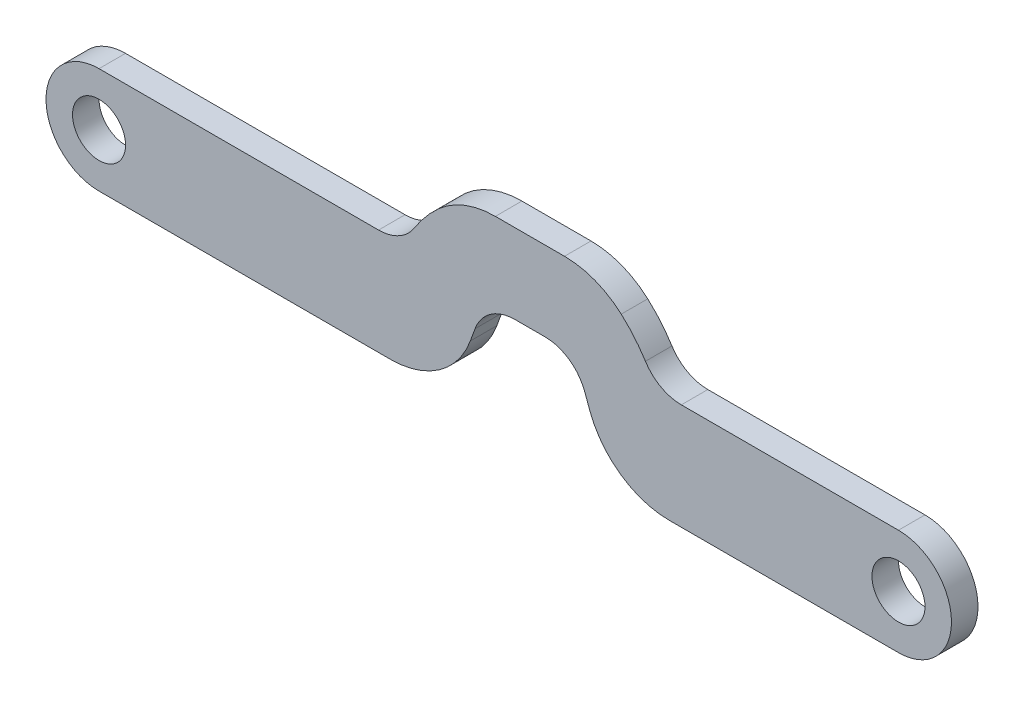
ISO-10303-21;
HEADER;
FILE_DESCRIPTION(('STEP AP214'),'2;1');
FILE_NAME('part.step','',(''),(''),'','','');
FILE_SCHEMA(('AUTOMOTIVE_DESIGN { 1 0 10303 214 1 1 1 1 }'));
ENDSEC;
DATA;
#1=APPLICATION_CONTEXT('core data for automotive mechanical design processes');
#2=APPLICATION_PROTOCOL_DEFINITION('international standard','automotive_design',2000,#1);
#3=PRODUCT_CONTEXT('',#1,'mechanical');
#4=PRODUCT('Part','Part','',(#3));
#5=PRODUCT_RELATED_PRODUCT_CATEGORY('part','',(#4));
#6=PRODUCT_DEFINITION_FORMATION('','',#4);
#7=PRODUCT_DEFINITION_CONTEXT('part definition',#1,'design');
#8=PRODUCT_DEFINITION('design','',#6,#7);
#9=PRODUCT_DEFINITION_SHAPE('','',#8);
#10=(LENGTH_UNIT() NAMED_UNIT(*) SI_UNIT(.MILLI.,.METRE.));
#11=(NAMED_UNIT(*) PLANE_ANGLE_UNIT() SI_UNIT($,.RADIAN.));
#12=(NAMED_UNIT(*) SI_UNIT($,.STERADIAN.) SOLID_ANGLE_UNIT());
#13=UNCERTAINTY_MEASURE_WITH_UNIT(LENGTH_MEASURE(1.E-05),#10,'distance_accuracy_value','');
#14=(GEOMETRIC_REPRESENTATION_CONTEXT(3) GLOBAL_UNCERTAINTY_ASSIGNED_CONTEXT((#13)) GLOBAL_UNIT_ASSIGNED_CONTEXT((#10,
#11,#12)) REPRESENTATION_CONTEXT('',''));
#15=CARTESIAN_POINT('',(0.,0.,0.));
#16=DIRECTION('',(0.,0.,1.));
#17=DIRECTION('',(1.,0.,0.));
#18=AXIS2_PLACEMENT_3D('',#15,#16,#17);
#19=CARTESIAN_POINT('',(0.,-2.,0.5));
#20=DIRECTION('',(0.,1.,0.));
#21=DIRECTION('',(-1.,0.,0.));
#22=AXIS2_PLACEMENT_3D('',#19,#20,#21);
#23=PLANE('',#22);
#24=DIRECTION('',(1.,0.,0.));
#25=VECTOR('',#24,1.);
#26=CARTESIAN_POINT('',(0.,-2.,0.5));
#27=LINE('',#26,#25);
#28=CARTESIAN_POINT('',(-8.64341319837332,-2.,0.5));
#29=VERTEX_POINT('',#28);
#30=CARTESIAN_POINT('',(0.,-2.,0.5));
#31=VERTEX_POINT('',#30);
#32=EDGE_CURVE('E176',#29,#31,#27,.T.);
#33=ORIENTED_EDGE('',*,*,#32,.F.);
#34=DIRECTION('',(0.,0.,1.));
#35=VECTOR('',#34,1.);
#36=CARTESIAN_POINT('',(-8.64341319837332,-2.,-0.5));
#37=LINE('',#36,#35);
#38=CARTESIAN_POINT('',(-8.64341319837332,-2.,-0.5));
#39=VERTEX_POINT('',#38);
#40=EDGE_CURVE('E62',#29,#39,#37,.F.);
#41=ORIENTED_EDGE('',*,*,#40,.T.);
#42=DIRECTION('',(1.,0.,0.));
#43=VECTOR('',#42,1.);
#44=CARTESIAN_POINT('',(0.,-2.,-0.5));
#45=LINE('',#44,#43);
#46=CARTESIAN_POINT('',(0.,-2.,-0.5));
#47=VERTEX_POINT('',#46);
#48=EDGE_CURVE('E199',#39,#47,#45,.T.);
#49=ORIENTED_EDGE('',*,*,#48,.T.);
#50=DIRECTION('',(0.,0.,-1.));
#51=VECTOR('',#50,1.);
#52=CARTESIAN_POINT('',(0.,-2.,0.5));
#53=LINE('',#52,#51);
#54=EDGE_CURVE('E194',#31,#47,#53,.T.);
#55=ORIENTED_EDGE('',*,*,#54,.F.);
#56=EDGE_LOOP('',(#33,#41,#49,#55));
#57=FACE_BOUND('',#56,.T.);
#58=ADVANCED_FACE('F39',(#57),#23,.F.);
#59=CARTESIAN_POINT('',(0.,0.,0.5));
#60=DIRECTION('',(0.,0.,1.));
#61=DIRECTION('',(1.,0.,0.));
#62=AXIS2_PLACEMENT_3D('',#59,#60,#61);
#63=PLANE('',#62);
#64=CARTESIAN_POINT('',(-13.9,0.,0.5));
#65=DIRECTION('',(0.,0.,1.));
#66=DIRECTION('',(1.,0.,0.));
#67=AXIS2_PLACEMENT_3D('',#64,#65,#66);
#68=CIRCLE('',#67,5.15);
#69=CARTESIAN_POINT('',(-9.543588377779,2.74666666666667,0.5));
#70=VERTEX_POINT('',#69);
#71=CARTESIAN_POINT('',(-10.4565238577648,3.82948717948718,0.5));
#72=VERTEX_POINT('',#71);
#73=EDGE_CURVE('E353',#70,#72,#68,.T.);
#74=ORIENTED_EDGE('',*,*,#73,.T.);
#75=CARTESIAN_POINT('',(-12.5961595189595,1.45,0.5));
#76=DIRECTION('',(0.,0.,1.));
#77=DIRECTION('',(1.,0.,0.));
#78=AXIS2_PLACEMENT_3D('',#75,#76,#77);
#79=CIRCLE('',#78,3.2);
#80=CARTESIAN_POINT('',(-12.5961595189595,4.65,0.5));
#81=VERTEX_POINT('',#80);
#82=EDGE_CURVE('E252',#72,#81,#79,.T.);
#83=ORIENTED_EDGE('',*,*,#82,.T.);
#84=DIRECTION('',(-1.,0.,0.));
#85=VECTOR('',#84,1.);
#86=CARTESIAN_POINT('',(0.,4.65,0.5));
#87=LINE('',#86,#85);
#88=CARTESIAN_POINT('',(-15.2038404810405,4.65,0.5));
#89=VERTEX_POINT('',#88);
#90=EDGE_CURVE('E345',#81,#89,#87,.T.);
#91=ORIENTED_EDGE('',*,*,#90,.T.);
#92=CARTESIAN_POINT('',(-15.2038404810405,1.45,0.5));
#93=DIRECTION('',(0.,0.,1.));
#94=DIRECTION('',(1.,0.,0.));
#95=AXIS2_PLACEMENT_3D('',#92,#93,#94);
#96=CIRCLE('',#95,3.2);
#97=CARTESIAN_POINT('',(-17.3434761422352,3.82948717948718,0.5));
#98=VERTEX_POINT('',#97);
#99=EDGE_CURVE('E250',#89,#98,#96,.T.);
#100=ORIENTED_EDGE('',*,*,#99,.T.);
#101=CARTESIAN_POINT('',(-18.256411622221,2.74666666666667,0.5));
#102=VERTEX_POINT('',#101);
#103=EDGE_CURVE('E354',#98,#102,#68,.T.);
#104=ORIENTED_EDGE('',*,*,#103,.T.);
#105=CARTESIAN_POINT('',(-19.6098598932023,3.6,0.5));
#106=DIRECTION('',(0.,0.,1.));
#107=DIRECTION('',(1.,0.,0.));
#108=AXIS2_PLACEMENT_3D('',#105,#106,#107);
#109=CIRCLE('',#108,1.6);
#110=CARTESIAN_POINT('',(-19.6098598932023,2.,0.5));
#111=VERTEX_POINT('',#110);
#112=EDGE_CURVE('E242',#102,#111,#109,.F.);
#113=ORIENTED_EDGE('',*,*,#112,.T.);
#114=DIRECTION('',(1.,0.,0.));
#115=VECTOR('',#114,1.);
#116=CARTESIAN_POINT('',(0.,2.,0.5));
#117=LINE('',#116,#115);
#118=CARTESIAN_POINT('',(-30.1536,2.,0.5));
#119=VERTEX_POINT('',#118);
#120=EDGE_CURVE('E293',#119,#111,#117,.T.);
#121=ORIENTED_EDGE('',*,*,#120,.F.);
#122=CARTESIAN_POINT('',(-30.1536,0.,0.5));
#123=DIRECTION('',(0.,0.,1.));
#124=DIRECTION('',(1.,0.,0.));
#125=AXIS2_PLACEMENT_3D('',#122,#123,#124);
#126=CIRCLE('',#125,2.);
#127=CARTESIAN_POINT('',(-30.1536,-2.,0.5));
#128=VERTEX_POINT('',#127);
#129=EDGE_CURVE('E287',#119,#128,#126,.T.);
#130=ORIENTED_EDGE('',*,*,#129,.T.);
#131=CARTESIAN_POINT('',(-19.1565868016267,-2.,0.5));
#132=VERTEX_POINT('',#131);
#133=EDGE_CURVE('E187',#128,#132,#27,.T.);
#134=ORIENTED_EDGE('',*,*,#133,.T.);
#135=CARTESIAN_POINT('',(-19.1565868016267,1.2,0.5));
#136=DIRECTION('',(0.,0.,1.));
#137=DIRECTION('',(1.,0.,0.));
#138=AXIS2_PLACEMENT_3D('',#135,#136,#137);
#139=CIRCLE('',#138,3.2);
#140=CARTESIAN_POINT('',(-16.1495704151118,0.105535541357851,0.5));
#141=VERTEX_POINT('',#140);
#142=EDGE_CURVE('E247',#132,#141,#139,.T.);
#143=ORIENTED_EDGE('',*,*,#142,.T.);
#144=DIRECTION('',(-0.342020143325671,-0.939692620785908,0.));
#145=VECTOR('',#144,1.);
#146=CARTESIAN_POINT('',(-14.2943480143666,5.20271719547167,0.5));
#147=LINE('',#146,#145);
#148=CARTESIAN_POINT('',(-15.9706074564059,0.59723222932107,0.5));
#149=VERTEX_POINT('',#148);
#150=EDGE_CURVE('E428',#149,#141,#147,.T.);
#151=ORIENTED_EDGE('',*,*,#150,.F.);
#152=CARTESIAN_POINT('',(-14.4670992631484,0.0499999999999962,0.5));
#153=DIRECTION('',(0.,0.,1.));
#154=DIRECTION('',(1.,0.,0.));
#155=AXIS2_PLACEMENT_3D('',#152,#153,#154);
#156=CIRCLE('',#155,1.6);
#157=CARTESIAN_POINT('',(-14.4670992631484,1.65,0.5));
#158=VERTEX_POINT('',#157);
#159=EDGE_CURVE('E231',#149,#158,#156,.F.);
#160=ORIENTED_EDGE('',*,*,#159,.T.);
#161=DIRECTION('',(1.,0.,0.));
#162=VECTOR('',#161,1.);
#163=CARTESIAN_POINT('',(0.,1.65,0.5));
#164=LINE('',#163,#162);
#165=CARTESIAN_POINT('',(-13.3329007368516,1.65,0.5));
#166=VERTEX_POINT('',#165);
#167=EDGE_CURVE('E434',#158,#166,#164,.T.);
#168=ORIENTED_EDGE('',*,*,#167,.T.);
#169=CARTESIAN_POINT('',(-13.3329007368516,0.0499999999999964,0.5));
#170=DIRECTION('',(0.,0.,1.));
#171=DIRECTION('',(1.,0.,0.));
#172=AXIS2_PLACEMENT_3D('',#169,#170,#171);
#173=CIRCLE('',#172,1.6);
#174=CARTESIAN_POINT('',(-11.8293925435941,0.597232229321065,0.5));
#175=VERTEX_POINT('',#174);
#176=EDGE_CURVE('E227',#166,#175,#173,.F.);
#177=ORIENTED_EDGE('',*,*,#176,.T.);
#178=DIRECTION('',(0.342020143325668,-0.939692620785909,0.));
#179=VECTOR('',#178,1.);
#180=CARTESIAN_POINT('',(-10.2536697449872,-3.73203057917125,0.5));
#181=LINE('',#180,#179);
#182=CARTESIAN_POINT('',(-11.6504295848882,0.105535541357863,0.5));
#183=VERTEX_POINT('',#182);
#184=EDGE_CURVE('E350',#175,#183,#181,.T.);
#185=ORIENTED_EDGE('',*,*,#184,.T.);
#186=CARTESIAN_POINT('',(-8.64341319837332,1.2,0.5));
#187=DIRECTION('',(0.,0.,1.));
#188=DIRECTION('',(1.,0.,0.));
#189=AXIS2_PLACEMENT_3D('',#186,#187,#188);
#190=CIRCLE('',#189,3.2);
#191=EDGE_CURVE('E185',#183,#29,#190,.T.);
#192=ORIENTED_EDGE('',*,*,#191,.T.);
#193=ORIENTED_EDGE('',*,*,#32,.T.);
#194=CARTESIAN_POINT('',(0.,0.,0.5));
#195=DIRECTION('',(0.,0.,1.));
#196=DIRECTION('',(1.,0.,0.));
#197=AXIS2_PLACEMENT_3D('',#194,#195,#196);
#198=CIRCLE('',#197,2.);
#199=CARTESIAN_POINT('',(0.,2.,0.5));
#200=VERTEX_POINT('',#199);
#201=EDGE_CURVE('E182',#31,#200,#198,.T.);
#202=ORIENTED_EDGE('',*,*,#201,.T.);
#203=CARTESIAN_POINT('',(-8.19014010679772,2.,0.5));
#204=VERTEX_POINT('',#203);
#205=EDGE_CURVE('E197',#204,#200,#117,.T.);
#206=ORIENTED_EDGE('',*,*,#205,.F.);
#207=CARTESIAN_POINT('',(-8.19014010679772,3.6,0.5));
#208=DIRECTION('',(0.,0.,1.));
#209=DIRECTION('',(1.,0.,0.));
#210=AXIS2_PLACEMENT_3D('',#207,#208,#209);
#211=CIRCLE('',#210,1.6);
#212=EDGE_CURVE('E235',#204,#70,#211,.F.);
#213=ORIENTED_EDGE('',*,*,#212,.T.);
#214=EDGE_LOOP('',(#74,#83,#91,#100,#104,#113,#121,#130,#134,#143,#151,#160,#168,#177,#185,#192,
#193,#202,#206,#213));
#215=FACE_BOUND('',#214,.T.);
#216=CARTESIAN_POINT('',(0.,0.,0.5));
#217=DIRECTION('',(0.,0.,1.));
#218=DIRECTION('',(1.,0.,0.));
#219=AXIS2_PLACEMENT_3D('',#216,#217,#218);
#220=CIRCLE('',#219,1.);
#221=CARTESIAN_POINT('',(1.,0.,0.5));
#222=VERTEX_POINT('',#221);
#223=EDGE_CURVE('E300',#222,#222,#220,.T.);
#224=ORIENTED_EDGE('',*,*,#223,.F.);
#225=EDGE_LOOP('',(#224));
#226=FACE_BOUND('',#225,.T.);
#227=CARTESIAN_POINT('',(-30.1536,0.,0.5));
#228=DIRECTION('',(0.,0.,1.));
#229=DIRECTION('',(1.,0.,0.));
#230=AXIS2_PLACEMENT_3D('',#227,#228,#229);
#231=CIRCLE('',#230,1.);
#232=CARTESIAN_POINT('',(-29.1536,0.,0.5));
#233=VERTEX_POINT('',#232);
#234=EDGE_CURVE('E297',#233,#233,#231,.T.);
#235=ORIENTED_EDGE('',*,*,#234,.F.);
#236=EDGE_LOOP('',(#235));
#237=FACE_BOUND('',#236,.T.);
#238=ADVANCED_FACE('F179',(#215,#226,#237),#63,.T.);
#239=CARTESIAN_POINT('',(0.,0.,-0.5));
#240=DIRECTION('',(0.,0.,1.));
#241=DIRECTION('',(1.,0.,0.));
#242=AXIS2_PLACEMENT_3D('',#239,#240,#241);
#243=PLANE('',#242);
#244=CARTESIAN_POINT('',(-30.1536,0.,-0.5));
#245=DIRECTION('',(0.,0.,1.));
#246=DIRECTION('',(1.,0.,0.));
#247=AXIS2_PLACEMENT_3D('',#244,#245,#246);
#248=CIRCLE('',#247,1.);
#249=CARTESIAN_POINT('',(-29.1536,0.,-0.5));
#250=VERTEX_POINT('',#249);
#251=EDGE_CURVE('E313',#250,#250,#248,.T.);
#252=ORIENTED_EDGE('',*,*,#251,.T.);
#253=EDGE_LOOP('',(#252));
#254=FACE_BOUND('',#253,.T.);
#255=CARTESIAN_POINT('',(0.,0.,-0.5));
#256=DIRECTION('',(0.,0.,1.));
#257=DIRECTION('',(1.,0.,0.));
#258=AXIS2_PLACEMENT_3D('',#255,#256,#257);
#259=CIRCLE('',#258,1.);
#260=CARTESIAN_POINT('',(1.,0.,-0.5));
#261=VERTEX_POINT('',#260);
#262=EDGE_CURVE('E188',#261,#261,#259,.T.);
#263=ORIENTED_EDGE('',*,*,#262,.T.);
#264=EDGE_LOOP('',(#263));
#265=FACE_BOUND('',#264,.T.);
#266=DIRECTION('',(-1.,0.,0.));
#267=VECTOR('',#266,1.);
#268=CARTESIAN_POINT('',(0.,4.65,-0.5));
#269=LINE('',#268,#267);
#270=CARTESIAN_POINT('',(-12.5961595189595,4.65,-0.5));
#271=VERTEX_POINT('',#270);
#272=CARTESIAN_POINT('',(-15.2038404810405,4.65,-0.5));
#273=VERTEX_POINT('',#272);
#274=EDGE_CURVE('E347',#271,#273,#269,.T.);
#275=ORIENTED_EDGE('',*,*,#274,.F.);
#276=CARTESIAN_POINT('',(-12.5961595189595,1.45,-0.5));
#277=DIRECTION('',(0.,0.,1.));
#278=DIRECTION('',(1.,0.,0.));
#279=AXIS2_PLACEMENT_3D('',#276,#277,#278);
#280=CIRCLE('',#279,3.2);
#281=CARTESIAN_POINT('',(-10.4565238577648,3.82948717948718,-0.5));
#282=VERTEX_POINT('',#281);
#283=EDGE_CURVE('E264',#271,#282,#280,.F.);
#284=ORIENTED_EDGE('',*,*,#283,.T.);
#285=CARTESIAN_POINT('',(-13.9,0.,-0.5));
#286=DIRECTION('',(0.,0.,1.));
#287=DIRECTION('',(1.,0.,0.));
#288=AXIS2_PLACEMENT_3D('',#285,#286,#287);
#289=CIRCLE('',#288,5.15);
#290=CARTESIAN_POINT('',(-9.543588377779,2.74666666666667,-0.5));
#291=VERTEX_POINT('',#290);
#292=EDGE_CURVE('E290',#291,#282,#289,.T.);
#293=ORIENTED_EDGE('',*,*,#292,.F.);
#294=CARTESIAN_POINT('',(-8.19014010679772,3.6,-0.5));
#295=DIRECTION('',(0.,0.,1.));
#296=DIRECTION('',(1.,0.,0.));
#297=AXIS2_PLACEMENT_3D('',#294,#295,#296);
#298=CIRCLE('',#297,1.6);
#299=CARTESIAN_POINT('',(-8.19014010679772,2.,-0.5));
#300=VERTEX_POINT('',#299);
#301=EDGE_CURVE('E237',#291,#300,#298,.T.);
#302=ORIENTED_EDGE('',*,*,#301,.T.);
#303=DIRECTION('',(1.,0.,0.));
#304=VECTOR('',#303,1.);
#305=CARTESIAN_POINT('',(0.,2.,-0.5));
#306=LINE('',#305,#304);
#307=CARTESIAN_POINT('',(0.,2.,-0.5));
#308=VERTEX_POINT('',#307);
#309=EDGE_CURVE('E307',#300,#308,#306,.T.);
#310=ORIENTED_EDGE('',*,*,#309,.T.);
#311=CARTESIAN_POINT('',(0.,0.,-0.5));
#312=DIRECTION('',(0.,0.,1.));
#313=DIRECTION('',(1.,0.,0.));
#314=AXIS2_PLACEMENT_3D('',#311,#312,#313);
#315=CIRCLE('',#314,2.);
#316=EDGE_CURVE('E305',#47,#308,#315,.T.);
#317=ORIENTED_EDGE('',*,*,#316,.F.);
#318=ORIENTED_EDGE('',*,*,#48,.F.);
#319=CARTESIAN_POINT('',(-8.64341319837332,1.2,-0.5));
#320=DIRECTION('',(0.,0.,1.));
#321=DIRECTION('',(1.,0.,0.));
#322=AXIS2_PLACEMENT_3D('',#319,#320,#321);
#323=CIRCLE('',#322,3.2);
#324=CARTESIAN_POINT('',(-11.6504295848882,0.105535541357863,-0.5));
#325=VERTEX_POINT('',#324);
#326=EDGE_CURVE('E54',#39,#325,#323,.F.);
#327=ORIENTED_EDGE('',*,*,#326,.T.);
#328=DIRECTION('',(0.342020143325668,-0.939692620785909,0.));
#329=VECTOR('',#328,1.);
#330=CARTESIAN_POINT('',(-10.2536697449872,-3.73203057917125,-0.5));
#331=LINE('',#330,#329);
#332=CARTESIAN_POINT('',(-11.8293925435941,0.597232229321065,-0.5));
#333=VERTEX_POINT('',#332);
#334=EDGE_CURVE('E433',#333,#325,#331,.T.);
#335=ORIENTED_EDGE('',*,*,#334,.F.);
#336=CARTESIAN_POINT('',(-13.3329007368516,0.0499999999999964,-0.5));
#337=DIRECTION('',(0.,0.,1.));
#338=DIRECTION('',(1.,0.,0.));
#339=AXIS2_PLACEMENT_3D('',#336,#337,#338);
#340=CIRCLE('',#339,1.6);
#341=CARTESIAN_POINT('',(-13.3329007368516,1.65,-0.5));
#342=VERTEX_POINT('',#341);
#343=EDGE_CURVE('E229',#333,#342,#340,.T.);
#344=ORIENTED_EDGE('',*,*,#343,.T.);
#345=DIRECTION('',(1.,0.,0.));
#346=VECTOR('',#345,1.);
#347=CARTESIAN_POINT('',(0.,1.65,-0.5));
#348=LINE('',#347,#346);
#349=CARTESIAN_POINT('',(-14.4670992631484,1.65,-0.5));
#350=VERTEX_POINT('',#349);
#351=EDGE_CURVE('E437',#350,#342,#348,.T.);
#352=ORIENTED_EDGE('',*,*,#351,.F.);
#353=CARTESIAN_POINT('',(-14.4670992631484,0.0499999999999962,-0.5));
#354=DIRECTION('',(0.,0.,1.));
#355=DIRECTION('',(1.,0.,0.));
#356=AXIS2_PLACEMENT_3D('',#353,#354,#355);
#357=CIRCLE('',#356,1.6);
#358=CARTESIAN_POINT('',(-15.9706074564059,0.59723222932107,-0.5));
#359=VERTEX_POINT('',#358);
#360=EDGE_CURVE('E233',#350,#359,#357,.T.);
#361=ORIENTED_EDGE('',*,*,#360,.T.);
#362=DIRECTION('',(-0.342020143325671,-0.939692620785908,0.));
#363=VECTOR('',#362,1.);
#364=CARTESIAN_POINT('',(-14.2943480143666,5.20271719547167,-0.5));
#365=LINE('',#364,#363);
#366=CARTESIAN_POINT('',(-16.1495704151118,0.105535541357851,-0.5));
#367=VERTEX_POINT('',#366);
#368=EDGE_CURVE('E336',#359,#367,#365,.T.);
#369=ORIENTED_EDGE('',*,*,#368,.T.);
#370=CARTESIAN_POINT('',(-19.1565868016267,1.2,-0.5));
#371=DIRECTION('',(0.,0.,1.));
#372=DIRECTION('',(1.,0.,0.));
#373=AXIS2_PLACEMENT_3D('',#370,#371,#372);
#374=CIRCLE('',#373,3.2);
#375=CARTESIAN_POINT('',(-19.1565868016267,-2.,-0.5));
#376=VERTEX_POINT('',#375);
#377=EDGE_CURVE('E259',#367,#376,#374,.F.);
#378=ORIENTED_EDGE('',*,*,#377,.T.);
#379=CARTESIAN_POINT('',(-30.1536,-2.,-0.5));
#380=VERTEX_POINT('',#379);
#381=EDGE_CURVE('E280',#380,#376,#45,.T.);
#382=ORIENTED_EDGE('',*,*,#381,.F.);
#383=CARTESIAN_POINT('',(-30.1536,0.,-0.5));
#384=DIRECTION('',(0.,0.,1.));
#385=DIRECTION('',(1.,0.,0.));
#386=AXIS2_PLACEMENT_3D('',#383,#384,#385);
#387=CIRCLE('',#386,2.);
#388=CARTESIAN_POINT('',(-30.1536,2.,-0.5));
#389=VERTEX_POINT('',#388);
#390=EDGE_CURVE('E311',#389,#380,#387,.T.);
#391=ORIENTED_EDGE('',*,*,#390,.F.);
#392=CARTESIAN_POINT('',(-19.6098598932023,2.,-0.5));
#393=VERTEX_POINT('',#392);
#394=EDGE_CURVE('E308',#389,#393,#306,.T.);
#395=ORIENTED_EDGE('',*,*,#394,.T.);
#396=CARTESIAN_POINT('',(-19.6098598932023,3.6,-0.5));
#397=DIRECTION('',(0.,0.,1.));
#398=DIRECTION('',(1.,0.,0.));
#399=AXIS2_PLACEMENT_3D('',#396,#397,#398);
#400=CIRCLE('',#399,1.6);
#401=CARTESIAN_POINT('',(-18.256411622221,2.74666666666667,-0.5));
#402=VERTEX_POINT('',#401);
#403=EDGE_CURVE('E239',#393,#402,#400,.T.);
#404=ORIENTED_EDGE('',*,*,#403,.T.);
#405=CARTESIAN_POINT('',(-17.3434761422352,3.82948717948718,-0.5));
#406=VERTEX_POINT('',#405);
#407=EDGE_CURVE('E332',#406,#402,#289,.T.);
#408=ORIENTED_EDGE('',*,*,#407,.F.);
#409=CARTESIAN_POINT('',(-15.2038404810405,1.45,-0.5));
#410=DIRECTION('',(0.,0.,1.));
#411=DIRECTION('',(1.,0.,0.));
#412=AXIS2_PLACEMENT_3D('',#409,#410,#411);
#413=CIRCLE('',#412,3.2);
#414=EDGE_CURVE('E262',#406,#273,#413,.F.);
#415=ORIENTED_EDGE('',*,*,#414,.T.);
#416=EDGE_LOOP('',(#275,#284,#293,#302,#310,#317,#318,#327,#335,#344,#352,#361,#369,#378,#382,
#391,#395,#404,#408,#415));
#417=FACE_BOUND('',#416,.T.);
#418=ADVANCED_FACE('F324',(#254,#265,#417),#243,.F.);
#419=CARTESIAN_POINT('',(-13.9,0.,0.5));
#420=DIRECTION('',(0.,0.,-1.));
#421=DIRECTION('',(-1.,0.,0.));
#422=AXIS2_PLACEMENT_3D('',#419,#420,#421);
#423=CYLINDRICAL_SURFACE('',#422,5.15);
#424=ORIENTED_EDGE('',*,*,#292,.T.);
#425=DIRECTION('',(0.,0.,-1.));
#426=VECTOR('',#425,1.);
#427=CARTESIAN_POINT('',(-10.4565238577648,3.82948717948718,0.5));
#428=LINE('',#427,#426);
#429=EDGE_CURVE('E244',#282,#72,#428,.F.);
#430=ORIENTED_EDGE('',*,*,#429,.T.);
#431=ORIENTED_EDGE('',*,*,#73,.F.);
#432=DIRECTION('',(0.,0.,-1.));
#433=VECTOR('',#432,1.);
#434=CARTESIAN_POINT('',(-9.543588377779,2.74666666666667,0.5));
#435=LINE('',#434,#433);
#436=EDGE_CURVE('E219',#70,#291,#435,.T.);
#437=ORIENTED_EDGE('',*,*,#436,.T.);
#438=EDGE_LOOP('',(#424,#430,#431,#437));
#439=FACE_BOUND('',#438,.T.);
#440=ADVANCED_FACE('F360',(#439),#423,.T.);
#441=ORIENTED_EDGE('',*,*,#103,.F.);
#442=DIRECTION('',(0.,0.,-1.));
#443=VECTOR('',#442,1.);
#444=CARTESIAN_POINT('',(-17.3434761422352,3.82948717948718,0.5));
#445=LINE('',#444,#443);
#446=EDGE_CURVE('E266',#98,#406,#445,.T.);
#447=ORIENTED_EDGE('',*,*,#446,.T.);
#448=ORIENTED_EDGE('',*,*,#407,.T.);
#449=DIRECTION('',(0.,0.,-1.));
#450=VECTOR('',#449,1.);
#451=CARTESIAN_POINT('',(-18.256411622221,2.74666666666667,0.5));
#452=LINE('',#451,#450);
#453=EDGE_CURVE('E224',#402,#102,#452,.F.);
#454=ORIENTED_EDGE('',*,*,#453,.T.);
#455=EDGE_LOOP('',(#441,#447,#448,#454));
#456=FACE_BOUND('',#455,.T.);
#457=ADVANCED_FACE('F395',(#456),#423,.T.);
#458=CARTESIAN_POINT('',(0.,2.,0.5));
#459=DIRECTION('',(0.,1.,0.));
#460=DIRECTION('',(-1.,0.,0.));
#461=AXIS2_PLACEMENT_3D('',#458,#459,#460);
#462=PLANE('',#461);
#463=ORIENTED_EDGE('',*,*,#309,.F.);
#464=DIRECTION('',(0.,0.,-1.));
#465=VECTOR('',#464,1.);
#466=CARTESIAN_POINT('',(-8.19014010679772,2.,0.5));
#467=LINE('',#466,#465);
#468=EDGE_CURVE('E216',#300,#204,#467,.F.);
#469=ORIENTED_EDGE('',*,*,#468,.T.);
#470=ORIENTED_EDGE('',*,*,#205,.T.);
#471=DIRECTION('',(0.,0.,-1.));
#472=VECTOR('',#471,1.);
#473=CARTESIAN_POINT('',(0.,2.,0.5));
#474=LINE('',#473,#472);
#475=EDGE_CURVE('E196',#200,#308,#474,.T.);
#476=ORIENTED_EDGE('',*,*,#475,.T.);
#477=EDGE_LOOP('',(#463,#469,#470,#476));
#478=FACE_BOUND('',#477,.T.);
#479=ADVANCED_FACE('F390',(#478),#462,.T.);
#480=ORIENTED_EDGE('',*,*,#120,.T.);
#481=DIRECTION('',(0.,0.,-1.));
#482=VECTOR('',#481,1.);
#483=CARTESIAN_POINT('',(-19.6098598932023,2.,0.5));
#484=LINE('',#483,#482);
#485=EDGE_CURVE('E221',#111,#393,#484,.T.);
#486=ORIENTED_EDGE('',*,*,#485,.T.);
#487=ORIENTED_EDGE('',*,*,#394,.F.);
#488=DIRECTION('',(0.,0.,-1.));
#489=VECTOR('',#488,1.);
#490=CARTESIAN_POINT('',(-30.1536,2.,0.5));
#491=LINE('',#490,#489);
#492=EDGE_CURVE('E205',#119,#389,#491,.T.);
#493=ORIENTED_EDGE('',*,*,#492,.F.);
#494=EDGE_LOOP('',(#480,#486,#487,#493));
#495=FACE_BOUND('',#494,.T.);
#496=ADVANCED_FACE('F325',(#495),#462,.T.);
#497=ORIENTED_EDGE('',*,*,#381,.T.);
#498=DIRECTION('',(0.,0.,1.));
#499=VECTOR('',#498,1.);
#500=CARTESIAN_POINT('',(-19.1565868016267,-2.,0.5));
#501=LINE('',#500,#499);
#502=EDGE_CURVE('E47',#376,#132,#501,.T.);
#503=ORIENTED_EDGE('',*,*,#502,.T.);
#504=ORIENTED_EDGE('',*,*,#133,.F.);
#505=DIRECTION('',(0.,0.,-1.));
#506=VECTOR('',#505,1.);
#507=CARTESIAN_POINT('',(-30.1536,-2.,0.5));
#508=LINE('',#507,#506);
#509=EDGE_CURVE('E303',#128,#380,#508,.T.);
#510=ORIENTED_EDGE('',*,*,#509,.T.);
#511=EDGE_LOOP('',(#497,#503,#504,#510));
#512=FACE_BOUND('',#511,.T.);
#513=ADVANCED_FACE('F277',(#512),#23,.F.);
#514=CARTESIAN_POINT('',(0.,0.,0.5));
#515=DIRECTION('',(0.,0.,-1.));
#516=DIRECTION('',(-1.,0.,0.));
#517=AXIS2_PLACEMENT_3D('',#514,#515,#516);
#518=CYLINDRICAL_SURFACE('',#517,2.);
#519=ORIENTED_EDGE('',*,*,#316,.T.);
#520=ORIENTED_EDGE('',*,*,#475,.F.);
#521=ORIENTED_EDGE('',*,*,#201,.F.);
#522=ORIENTED_EDGE('',*,*,#54,.T.);
#523=EDGE_LOOP('',(#519,#520,#521,#522));
#524=FACE_BOUND('',#523,.T.);
#525=ADVANCED_FACE('F193',(#524),#518,.T.);
#526=CARTESIAN_POINT('',(-30.1536,0.,0.5));
#527=DIRECTION('',(0.,0.,-1.));
#528=DIRECTION('',(-1.,0.,0.));
#529=AXIS2_PLACEMENT_3D('',#526,#527,#528);
#530=CYLINDRICAL_SURFACE('',#529,1.);
#531=ORIENTED_EDGE('',*,*,#234,.T.);
#532=EDGE_LOOP('',(#531));
#533=FACE_BOUND('',#532,.T.);
#534=ORIENTED_EDGE('',*,*,#251,.F.);
#535=EDGE_LOOP('',(#534));
#536=FACE_BOUND('',#535,.T.);
#537=ADVANCED_FACE('F389',(#533,#536),#530,.F.);
#538=CARTESIAN_POINT('',(-30.1536,0.,0.5));
#539=DIRECTION('',(0.,0.,-1.));
#540=DIRECTION('',(-1.,0.,0.));
#541=AXIS2_PLACEMENT_3D('',#538,#539,#540);
#542=CYLINDRICAL_SURFACE('',#541,2.);
#543=ORIENTED_EDGE('',*,*,#390,.T.);
#544=ORIENTED_EDGE('',*,*,#509,.F.);
#545=ORIENTED_EDGE('',*,*,#129,.F.);
#546=ORIENTED_EDGE('',*,*,#492,.T.);
#547=EDGE_LOOP('',(#543,#544,#545,#546));
#548=FACE_BOUND('',#547,.T.);
#549=ADVANCED_FACE('F320',(#548),#542,.T.);
#550=CARTESIAN_POINT('',(0.,0.,0.5));
#551=DIRECTION('',(0.,0.,-1.));
#552=DIRECTION('',(-1.,0.,0.));
#553=AXIS2_PLACEMENT_3D('',#550,#551,#552);
#554=CYLINDRICAL_SURFACE('',#553,1.);
#555=ORIENTED_EDGE('',*,*,#223,.T.);
#556=EDGE_LOOP('',(#555));
#557=FACE_BOUND('',#556,.T.);
#558=ORIENTED_EDGE('',*,*,#262,.F.);
#559=EDGE_LOOP('',(#558));
#560=FACE_BOUND('',#559,.T.);
#561=ADVANCED_FACE('F400',(#557,#560),#554,.F.);
#562=CARTESIAN_POINT('',(0.,4.65,-0.5));
#563=DIRECTION('',(0.,1.,0.));
#564=DIRECTION('',(0.,0.,1.));
#565=AXIS2_PLACEMENT_3D('',#562,#563,#564);
#566=PLANE('',#565);
#567=ORIENTED_EDGE('',*,*,#90,.F.);
#568=DIRECTION('',(0.,0.,1.));
#569=VECTOR('',#568,1.);
#570=CARTESIAN_POINT('',(-12.5961595189595,4.65,-0.5));
#571=LINE('',#570,#569);
#572=EDGE_CURVE('E257',#81,#271,#571,.F.);
#573=ORIENTED_EDGE('',*,*,#572,.T.);
#574=ORIENTED_EDGE('',*,*,#274,.T.);
#575=DIRECTION('',(0.,0.,1.));
#576=VECTOR('',#575,1.);
#577=CARTESIAN_POINT('',(-15.2038404810405,4.65,0.5));
#578=LINE('',#577,#576);
#579=EDGE_CURVE('E254',#273,#89,#578,.T.);
#580=ORIENTED_EDGE('',*,*,#579,.T.);
#581=EDGE_LOOP('',(#567,#573,#574,#580));
#582=FACE_BOUND('',#581,.T.);
#583=ADVANCED_FACE('F344',(#582),#566,.T.);
#584=CARTESIAN_POINT('',(-14.2943480143666,5.20271719547167,-0.5));
#585=DIRECTION('',(-0.939692620785908,0.342020143325671,0.));
#586=DIRECTION('',(-0.342020143325671,-0.939692620785908,0.));
#587=AXIS2_PLACEMENT_3D('',#584,#585,#586);
#588=PLANE('',#587);
#589=ORIENTED_EDGE('',*,*,#150,.T.);
#590=DIRECTION('',(0.,0.,1.));
#591=VECTOR('',#590,1.);
#592=CARTESIAN_POINT('',(-16.1495704151118,0.105535541357851,-0.5));
#593=LINE('',#592,#591);
#594=EDGE_CURVE('E11',#141,#367,#593,.F.);
#595=ORIENTED_EDGE('',*,*,#594,.T.);
#596=ORIENTED_EDGE('',*,*,#368,.F.);
#597=DIRECTION('',(0.,0.,1.));
#598=VECTOR('',#597,1.);
#599=CARTESIAN_POINT('',(-15.9706074564059,0.59723222932107,-0.5));
#600=LINE('',#599,#598);
#601=EDGE_CURVE('E213',#359,#149,#600,.T.);
#602=ORIENTED_EDGE('',*,*,#601,.T.);
#603=EDGE_LOOP('',(#589,#595,#596,#602));
#604=FACE_BOUND('',#603,.T.);
#605=ADVANCED_FACE('F414',(#604),#588,.F.);
#606=CARTESIAN_POINT('',(0.,1.65,-0.5));
#607=DIRECTION('',(0.,-1.,0.));
#608=DIRECTION('',(0.,0.,-1.));
#609=AXIS2_PLACEMENT_3D('',#606,#607,#608);
#610=PLANE('',#609);
#611=ORIENTED_EDGE('',*,*,#351,.T.);
#612=DIRECTION('',(0.,0.,1.));
#613=VECTOR('',#612,1.);
#614=CARTESIAN_POINT('',(-13.3329007368516,1.65,0.5));
#615=LINE('',#614,#613);
#616=EDGE_CURVE('E203',#342,#166,#615,.T.);
#617=ORIENTED_EDGE('',*,*,#616,.T.);
#618=ORIENTED_EDGE('',*,*,#167,.F.);
#619=DIRECTION('',(0.,0.,1.));
#620=VECTOR('',#619,1.);
#621=CARTESIAN_POINT('',(-14.4670992631484,1.65,-0.5));
#622=LINE('',#621,#620);
#623=EDGE_CURVE('E201',#158,#350,#622,.F.);
#624=ORIENTED_EDGE('',*,*,#623,.T.);
#625=EDGE_LOOP('',(#611,#617,#618,#624));
#626=FACE_BOUND('',#625,.T.);
#627=ADVANCED_FACE('F419',(#626),#610,.T.);
#628=CARTESIAN_POINT('',(-10.2536697449872,-3.73203057917125,-0.5));
#629=DIRECTION('',(-0.939692620785909,-0.342020143325668,0.));
#630=DIRECTION('',(0.342020143325668,-0.939692620785909,0.));
#631=AXIS2_PLACEMENT_3D('',#628,#629,#630);
#632=PLANE('',#631);
#633=ORIENTED_EDGE('',*,*,#334,.T.);
#634=DIRECTION('',(0.,0.,1.));
#635=VECTOR('',#634,1.);
#636=CARTESIAN_POINT('',(-11.6504295848882,0.105535541357863,0.5));
#637=LINE('',#636,#635);
#638=EDGE_CURVE('E268',#325,#183,#637,.T.);
#639=ORIENTED_EDGE('',*,*,#638,.T.);
#640=ORIENTED_EDGE('',*,*,#184,.F.);
#641=DIRECTION('',(0.,0.,1.));
#642=VECTOR('',#641,1.);
#643=CARTESIAN_POINT('',(-11.8293925435941,0.597232229321065,-0.5));
#644=LINE('',#643,#642);
#645=EDGE_CURVE('E211',#175,#333,#644,.F.);
#646=ORIENTED_EDGE('',*,*,#645,.T.);
#647=EDGE_LOOP('',(#633,#639,#640,#646));
#648=FACE_BOUND('',#647,.T.);
#649=ADVANCED_FACE('F415',(#648),#632,.T.);
#650=CARTESIAN_POINT('',(-13.3329007368516,0.0499999999999964,-0.5));
#651=DIRECTION('',(0.,0.,-1.));
#652=DIRECTION('',(-1.,0.,0.));
#653=AXIS2_PLACEMENT_3D('',#650,#651,#652);
#654=CYLINDRICAL_SURFACE('',#653,1.6);
#655=ORIENTED_EDGE('',*,*,#343,.F.);
#656=ORIENTED_EDGE('',*,*,#645,.F.);
#657=ORIENTED_EDGE('',*,*,#176,.F.);
#658=ORIENTED_EDGE('',*,*,#616,.F.);
#659=EDGE_LOOP('',(#655,#656,#657,#658));
#660=FACE_BOUND('',#659,.T.);
#661=ADVANCED_FACE('F418',(#660),#654,.F.);
#662=CARTESIAN_POINT('',(-14.4670992631484,0.0499999999999962,-0.5));
#663=DIRECTION('',(0.,0.,1.));
#664=DIRECTION('',(1.,0.,0.));
#665=AXIS2_PLACEMENT_3D('',#662,#663,#664);
#666=CYLINDRICAL_SURFACE('',#665,1.6);
#667=ORIENTED_EDGE('',*,*,#360,.F.);
#668=ORIENTED_EDGE('',*,*,#623,.F.);
#669=ORIENTED_EDGE('',*,*,#159,.F.);
#670=ORIENTED_EDGE('',*,*,#601,.F.);
#671=EDGE_LOOP('',(#667,#668,#669,#670));
#672=FACE_BOUND('',#671,.T.);
#673=ADVANCED_FACE('F450',(#672),#666,.F.);
#674=CARTESIAN_POINT('',(-8.19014010679772,3.6,0.5));
#675=DIRECTION('',(0.,0.,-1.));
#676=DIRECTION('',(-1.,0.,0.));
#677=AXIS2_PLACEMENT_3D('',#674,#675,#676);
#678=CYLINDRICAL_SURFACE('',#677,1.6);
#679=ORIENTED_EDGE('',*,*,#301,.F.);
#680=ORIENTED_EDGE('',*,*,#436,.F.);
#681=ORIENTED_EDGE('',*,*,#212,.F.);
#682=ORIENTED_EDGE('',*,*,#468,.F.);
#683=EDGE_LOOP('',(#679,#680,#681,#682));
#684=FACE_BOUND('',#683,.T.);
#685=ADVANCED_FACE('F374',(#684),#678,.F.);
#686=CARTESIAN_POINT('',(-19.6098598932023,3.6,0.5));
#687=DIRECTION('',(0.,0.,-1.));
#688=DIRECTION('',(-1.,0.,0.));
#689=AXIS2_PLACEMENT_3D('',#686,#687,#688);
#690=CYLINDRICAL_SURFACE('',#689,1.6);
#691=ORIENTED_EDGE('',*,*,#112,.F.);
#692=ORIENTED_EDGE('',*,*,#453,.F.);
#693=ORIENTED_EDGE('',*,*,#403,.F.);
#694=ORIENTED_EDGE('',*,*,#485,.F.);
#695=EDGE_LOOP('',(#691,#692,#693,#694));
#696=FACE_BOUND('',#695,.T.);
#697=ADVANCED_FACE('F329',(#696),#690,.F.);
#698=CARTESIAN_POINT('',(-12.5961595189595,1.45,0.5));
#699=DIRECTION('',(0.,0.,-1.));
#700=DIRECTION('',(-1.,0.,0.));
#701=AXIS2_PLACEMENT_3D('',#698,#699,#700);
#702=CYLINDRICAL_SURFACE('',#701,3.2);
#703=ORIENTED_EDGE('',*,*,#283,.F.);
#704=ORIENTED_EDGE('',*,*,#572,.F.);
#705=ORIENTED_EDGE('',*,*,#82,.F.);
#706=ORIENTED_EDGE('',*,*,#429,.F.);
#707=EDGE_LOOP('',(#703,#704,#705,#706));
#708=FACE_BOUND('',#707,.T.);
#709=ADVANCED_FACE('F365',(#708),#702,.T.);
#710=CARTESIAN_POINT('',(-15.2038404810405,1.45,0.5));
#711=DIRECTION('',(0.,0.,-1.));
#712=DIRECTION('',(-1.,0.,0.));
#713=AXIS2_PLACEMENT_3D('',#710,#711,#712);
#714=CYLINDRICAL_SURFACE('',#713,3.2);
#715=ORIENTED_EDGE('',*,*,#414,.F.);
#716=ORIENTED_EDGE('',*,*,#446,.F.);
#717=ORIENTED_EDGE('',*,*,#99,.F.);
#718=ORIENTED_EDGE('',*,*,#579,.F.);
#719=EDGE_LOOP('',(#715,#716,#717,#718));
#720=FACE_BOUND('',#719,.T.);
#721=ADVANCED_FACE('F340',(#720),#714,.T.);
#722=CARTESIAN_POINT('',(-8.64341319837332,1.2,-0.5));
#723=DIRECTION('',(0.,0.,-1.));
#724=DIRECTION('',(-1.,0.,0.));
#725=AXIS2_PLACEMENT_3D('',#722,#723,#724);
#726=CYLINDRICAL_SURFACE('',#725,3.2);
#727=ORIENTED_EDGE('',*,*,#326,.F.);
#728=ORIENTED_EDGE('',*,*,#40,.F.);
#729=ORIENTED_EDGE('',*,*,#191,.F.);
#730=ORIENTED_EDGE('',*,*,#638,.F.);
#731=EDGE_LOOP('',(#727,#728,#729,#730));
#732=FACE_BOUND('',#731,.T.);
#733=ADVANCED_FACE('F372',(#732),#726,.T.);
#734=CARTESIAN_POINT('',(-19.1565868016267,1.2,0.5));
#735=DIRECTION('',(0.,0.,1.));
#736=DIRECTION('',(1.,0.,0.));
#737=AXIS2_PLACEMENT_3D('',#734,#735,#736);
#738=CYLINDRICAL_SURFACE('',#737,3.2);
#739=ORIENTED_EDGE('',*,*,#377,.F.);
#740=ORIENTED_EDGE('',*,*,#594,.F.);
#741=ORIENTED_EDGE('',*,*,#142,.F.);
#742=ORIENTED_EDGE('',*,*,#502,.F.);
#743=EDGE_LOOP('',(#739,#740,#741,#742));
#744=FACE_BOUND('',#743,.T.);
#745=ADVANCED_FACE('F41',(#744),#738,.T.);
#746=CLOSED_SHELL('',(#58,#238,#418,#440,#457,#479,#496,#513,#525,#537,#549,#561,#583,#605,#627,
#649,#661,#673,#685,#697,#709,#721,#733,#745));
#747=MANIFOLD_SOLID_BREP('B2',#746);
#748=ADVANCED_BREP_SHAPE_REPRESENTATION('',(#18,#747),#14);
#749=SHAPE_DEFINITION_REPRESENTATION(#9,#748);
ENDSEC;
END-ISO-10303-21;
